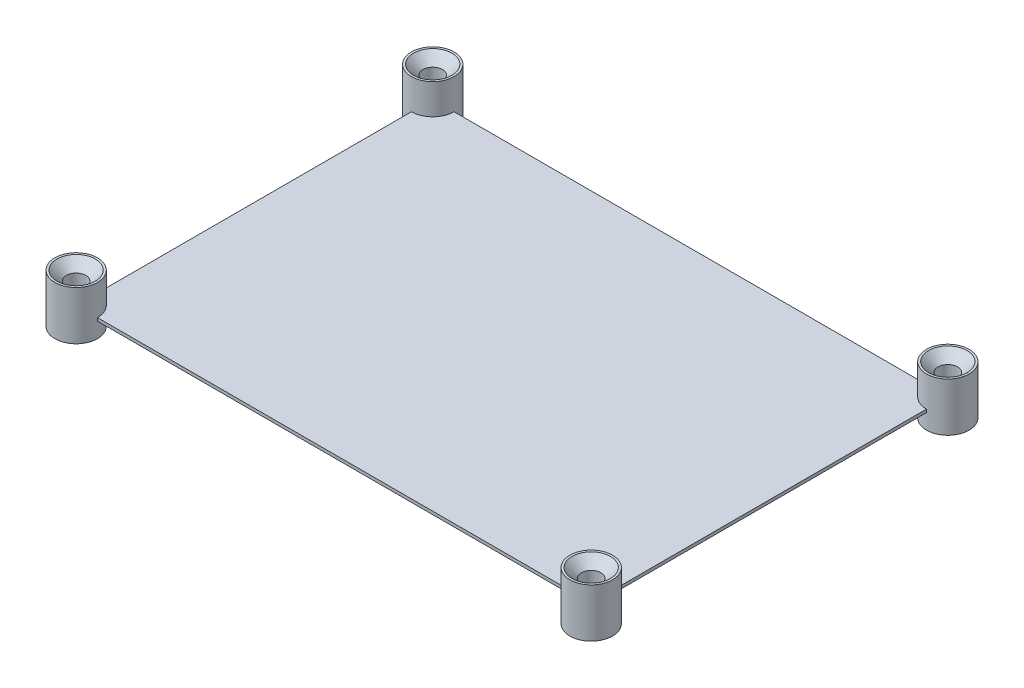
ISO-10303-21;
HEADER;
FILE_DESCRIPTION(('STEP AP214'),'2;1');
FILE_NAME('part.step','',(''),(''),'','','');
FILE_SCHEMA(('AUTOMOTIVE_DESIGN { 1 0 10303 214 1 1 1 1 }'));
ENDSEC;
DATA;
#1=APPLICATION_CONTEXT('core data for automotive mechanical design processes');
#2=APPLICATION_PROTOCOL_DEFINITION('international standard','automotive_design',2000,#1);
#3=PRODUCT_CONTEXT('',#1,'mechanical');
#4=PRODUCT('Part','Part','',(#3));
#5=PRODUCT_RELATED_PRODUCT_CATEGORY('part','',(#4));
#6=PRODUCT_DEFINITION_FORMATION('','',#4);
#7=PRODUCT_DEFINITION_CONTEXT('part definition',#1,'design');
#8=PRODUCT_DEFINITION('design','',#6,#7);
#9=PRODUCT_DEFINITION_SHAPE('','',#8);
#10=(LENGTH_UNIT() NAMED_UNIT(*) SI_UNIT(.MILLI.,.METRE.));
#11=(NAMED_UNIT(*) PLANE_ANGLE_UNIT() SI_UNIT($,.RADIAN.));
#12=(NAMED_UNIT(*) SI_UNIT($,.STERADIAN.) SOLID_ANGLE_UNIT());
#13=UNCERTAINTY_MEASURE_WITH_UNIT(LENGTH_MEASURE(1.E-05),#10,'distance_accuracy_value','');
#14=(GEOMETRIC_REPRESENTATION_CONTEXT(3) GLOBAL_UNCERTAINTY_ASSIGNED_CONTEXT((#13)) GLOBAL_UNIT_ASSIGNED_CONTEXT((#10,
#11,#12)) REPRESENTATION_CONTEXT('',''));
#15=CARTESIAN_POINT('',(0.,0.,0.));
#16=DIRECTION('',(0.,0.,1.));
#17=DIRECTION('',(1.,0.,0.));
#18=AXIS2_PLACEMENT_3D('',#15,#16,#17);
#19=CARTESIAN_POINT('',(0.,0.5,0.));
#20=DIRECTION('',(-1.,0.,0.));
#21=DIRECTION('',(0.,0.,1.));
#22=AXIS2_PLACEMENT_3D('',#19,#20,#21);
#23=PLANE('',#22);
#24=DIRECTION('',(0.,0.,-1.));
#25=VECTOR('',#24,1.);
#26=CARTESIAN_POINT('',(0.,0.,0.));
#27=LINE('',#26,#25);
#28=CARTESIAN_POINT('',(0.,0.,55.));
#29=VERTEX_POINT('',#28);
#30=CARTESIAN_POINT('',(0.,0.,3.50000000000001));
#31=VERTEX_POINT('',#30);
#32=EDGE_CURVE('E123',#29,#31,#27,.T.);
#33=ORIENTED_EDGE('',*,*,#32,.T.);
#34=DIRECTION('',(0.,1.,0.));
#35=VECTOR('',#34,1.);
#36=CARTESIAN_POINT('',(0.,-2.5,3.50000000000001));
#37=LINE('',#36,#35);
#38=CARTESIAN_POINT('',(0.,0.5,3.50000000000001));
#39=VERTEX_POINT('',#38);
#40=EDGE_CURVE('E70',#31,#39,#37,.T.);
#41=ORIENTED_EDGE('',*,*,#40,.T.);
#42=DIRECTION('',(0.,0.,-1.));
#43=VECTOR('',#42,1.);
#44=CARTESIAN_POINT('',(0.,0.5,0.));
#45=LINE('',#44,#43);
#46=CARTESIAN_POINT('',(0.,0.5,55.));
#47=VERTEX_POINT('',#46);
#48=EDGE_CURVE('E194',#47,#39,#45,.T.);
#49=ORIENTED_EDGE('',*,*,#48,.F.);
#50=DIRECTION('',(0.,1.,0.));
#51=VECTOR('',#50,1.);
#52=CARTESIAN_POINT('',(0.,-2.5,55.));
#53=LINE('',#52,#51);
#54=EDGE_CURVE('E151',#47,#29,#53,.F.);
#55=ORIENTED_EDGE('',*,*,#54,.T.);
#56=EDGE_LOOP('',(#33,#41,#49,#55));
#57=FACE_BOUND('',#56,.T.);
#58=ADVANCED_FACE('F45',(#57),#23,.F.);
#59=CARTESIAN_POINT('',(0.,0.5,0.));
#60=DIRECTION('',(0.,0.,1.));
#61=DIRECTION('',(1.,0.,0.));
#62=AXIS2_PLACEMENT_3D('',#59,#60,#61);
#63=PLANE('',#62);
#64=DIRECTION('',(-1.,0.,0.));
#65=VECTOR('',#64,1.);
#66=CARTESIAN_POINT('',(0.,0.5,0.));
#67=LINE('',#66,#65);
#68=CARTESIAN_POINT('',(-3.50000000000001,0.5,0.));
#69=VERTEX_POINT('',#68);
#70=CARTESIAN_POINT('',(-81.,0.5,0.));
#71=VERTEX_POINT('',#70);
#72=EDGE_CURVE('E128',#69,#71,#67,.T.);
#73=ORIENTED_EDGE('',*,*,#72,.F.);
#74=DIRECTION('',(0.,1.,0.));
#75=VECTOR('',#74,1.);
#76=CARTESIAN_POINT('',(-3.50000000000001,-2.5,0.));
#77=LINE('',#76,#75);
#78=CARTESIAN_POINT('',(-3.50000000000001,0.,0.));
#79=VERTEX_POINT('',#78);
#80=EDGE_CURVE('E126',#69,#79,#77,.F.);
#81=ORIENTED_EDGE('',*,*,#80,.T.);
#82=DIRECTION('',(-1.,0.,0.));
#83=VECTOR('',#82,1.);
#84=CARTESIAN_POINT('',(0.,0.,0.));
#85=LINE('',#84,#83);
#86=CARTESIAN_POINT('',(-81.,0.,0.));
#87=VERTEX_POINT('',#86);
#88=EDGE_CURVE('E113',#79,#87,#85,.T.);
#89=ORIENTED_EDGE('',*,*,#88,.T.);
#90=DIRECTION('',(0.,1.,0.));
#91=VECTOR('',#90,1.);
#92=CARTESIAN_POINT('',(-81.,-2.5,0.));
#93=LINE('',#92,#91);
#94=EDGE_CURVE('E188',#87,#71,#93,.T.);
#95=ORIENTED_EDGE('',*,*,#94,.T.);
#96=EDGE_LOOP('',(#73,#81,#89,#95));
#97=FACE_BOUND('',#96,.T.);
#98=ADVANCED_FACE('F127',(#97),#63,.F.);
#99=CARTESIAN_POINT('',(-84.5,0.5,0.));
#100=DIRECTION('',(1.,0.,0.));
#101=DIRECTION('',(0.,0.,-1.));
#102=AXIS2_PLACEMENT_3D('',#99,#100,#101);
#103=PLANE('',#102);
#104=DIRECTION('',(0.,0.,1.));
#105=VECTOR('',#104,1.);
#106=CARTESIAN_POINT('',(-84.5,0.,0.));
#107=LINE('',#106,#105);
#108=CARTESIAN_POINT('',(-84.5,0.,3.50000000000002));
#109=VERTEX_POINT('',#108);
#110=CARTESIAN_POINT('',(-84.5,0.,55.));
#111=VERTEX_POINT('',#110);
#112=EDGE_CURVE('E122',#109,#111,#107,.T.);
#113=ORIENTED_EDGE('',*,*,#112,.T.);
#114=DIRECTION('',(0.,1.,0.));
#115=VECTOR('',#114,1.);
#116=CARTESIAN_POINT('',(-84.5,-2.5,55.));
#117=LINE('',#116,#115);
#118=CARTESIAN_POINT('',(-84.5,0.5,55.));
#119=VERTEX_POINT('',#118);
#120=EDGE_CURVE('E170',#111,#119,#117,.T.);
#121=ORIENTED_EDGE('',*,*,#120,.T.);
#122=DIRECTION('',(0.,0.,1.));
#123=VECTOR('',#122,1.);
#124=CARTESIAN_POINT('',(-84.5,0.5,0.));
#125=LINE('',#124,#123);
#126=CARTESIAN_POINT('',(-84.5,0.5,3.50000000000002));
#127=VERTEX_POINT('',#126);
#128=EDGE_CURVE('E200',#127,#119,#125,.T.);
#129=ORIENTED_EDGE('',*,*,#128,.F.);
#130=DIRECTION('',(0.,1.,0.));
#131=VECTOR('',#130,1.);
#132=CARTESIAN_POINT('',(-84.5,-2.5,3.50000000000002));
#133=LINE('',#132,#131);
#134=EDGE_CURVE('E184',#127,#109,#133,.F.);
#135=ORIENTED_EDGE('',*,*,#134,.T.);
#136=EDGE_LOOP('',(#113,#121,#129,#135));
#137=FACE_BOUND('',#136,.T.);
#138=ADVANCED_FACE('F293',(#137),#103,.F.);
#139=CARTESIAN_POINT('',(0.,0.5,58.5));
#140=DIRECTION('',(0.,0.,-1.));
#141=DIRECTION('',(-1.,0.,0.));
#142=AXIS2_PLACEMENT_3D('',#139,#140,#141);
#143=PLANE('',#142);
#144=DIRECTION('',(1.,0.,0.));
#145=VECTOR('',#144,1.);
#146=CARTESIAN_POINT('',(0.,0.,58.5));
#147=LINE('',#146,#145);
#148=CARTESIAN_POINT('',(-81.,0.,58.5));
#149=VERTEX_POINT('',#148);
#150=CARTESIAN_POINT('',(-3.5,0.,58.5));
#151=VERTEX_POINT('',#150);
#152=EDGE_CURVE('E197',#149,#151,#147,.T.);
#153=ORIENTED_EDGE('',*,*,#152,.T.);
#154=DIRECTION('',(0.,1.,0.));
#155=VECTOR('',#154,1.);
#156=CARTESIAN_POINT('',(-3.5,-2.5,58.5));
#157=LINE('',#156,#155);
#158=CARTESIAN_POINT('',(-3.5,0.5,58.5));
#159=VERTEX_POINT('',#158);
#160=EDGE_CURVE('E148',#151,#159,#157,.T.);
#161=ORIENTED_EDGE('',*,*,#160,.T.);
#162=DIRECTION('',(1.,0.,0.));
#163=VECTOR('',#162,1.);
#164=CARTESIAN_POINT('',(0.,0.5,58.5));
#165=LINE('',#164,#163);
#166=CARTESIAN_POINT('',(-81.,0.5,58.5));
#167=VERTEX_POINT('',#166);
#168=EDGE_CURVE('E204',#167,#159,#165,.T.);
#169=ORIENTED_EDGE('',*,*,#168,.F.);
#170=DIRECTION('',(0.,1.,0.));
#171=VECTOR('',#170,1.);
#172=CARTESIAN_POINT('',(-81.,-2.5,58.5));
#173=LINE('',#172,#171);
#174=EDGE_CURVE('E166',#167,#149,#173,.F.);
#175=ORIENTED_EDGE('',*,*,#174,.T.);
#176=EDGE_LOOP('',(#153,#161,#169,#175));
#177=FACE_BOUND('',#176,.T.);
#178=ADVANCED_FACE('F298',(#177),#143,.F.);
#179=CARTESIAN_POINT('',(0.,0.5,0.));
#180=DIRECTION('',(0.,-1.,0.));
#181=DIRECTION('',(0.,0.,-1.));
#182=AXIS2_PLACEMENT_3D('',#179,#180,#181);
#183=PLANE('',#182);
#184=ORIENTED_EDGE('',*,*,#48,.T.);
#185=CARTESIAN_POINT('',(0.,0.5,0.));
#186=DIRECTION('',(0.,-1.,0.));
#187=DIRECTION('',(0.,0.,-1.));
#188=AXIS2_PLACEMENT_3D('',#185,#186,#187);
#189=CIRCLE('',#188,3.50000000000001);
#190=EDGE_CURVE('E62',#39,#69,#189,.T.);
#191=ORIENTED_EDGE('',*,*,#190,.T.);
#192=ORIENTED_EDGE('',*,*,#72,.T.);
#193=CARTESIAN_POINT('',(-84.5,0.5,0.));
#194=DIRECTION('',(0.,-1.,0.));
#195=DIRECTION('',(0.,0.,-1.));
#196=AXIS2_PLACEMENT_3D('',#193,#194,#195);
#197=CIRCLE('',#196,3.50000000000001);
#198=EDGE_CURVE('E191',#71,#127,#197,.T.);
#199=ORIENTED_EDGE('',*,*,#198,.T.);
#200=ORIENTED_EDGE('',*,*,#128,.T.);
#201=CARTESIAN_POINT('',(-84.5,0.5,58.5));
#202=DIRECTION('',(0.,-1.,0.));
#203=DIRECTION('',(0.,0.,-1.));
#204=AXIS2_PLACEMENT_3D('',#201,#202,#203);
#205=CIRCLE('',#204,3.50000000000001);
#206=EDGE_CURVE('E173',#119,#167,#205,.T.);
#207=ORIENTED_EDGE('',*,*,#206,.T.);
#208=ORIENTED_EDGE('',*,*,#168,.T.);
#209=CARTESIAN_POINT('',(0.,0.5,58.5));
#210=DIRECTION('',(0.,-1.,0.));
#211=DIRECTION('',(0.,0.,-1.));
#212=AXIS2_PLACEMENT_3D('',#209,#210,#211);
#213=CIRCLE('',#212,3.50000000000001);
#214=EDGE_CURVE('E155',#159,#47,#213,.T.);
#215=ORIENTED_EDGE('',*,*,#214,.T.);
#216=EDGE_LOOP('',(#184,#191,#192,#199,#200,#207,#208,#215));
#217=FACE_BOUND('',#216,.T.);
#218=ADVANCED_FACE('F303',(#217),#183,.F.);
#219=CARTESIAN_POINT('',(0.,0.,0.));
#220=DIRECTION('',(0.,-1.,0.));
#221=DIRECTION('',(0.,0.,-1.));
#222=AXIS2_PLACEMENT_3D('',#219,#220,#221);
#223=PLANE('',#222);
#224=CARTESIAN_POINT('',(0.,0.,0.));
#225=DIRECTION('',(0.,-1.,0.));
#226=DIRECTION('',(0.,0.,-1.));
#227=AXIS2_PLACEMENT_3D('',#224,#225,#226);
#228=CIRCLE('',#227,3.50000000000001);
#229=EDGE_CURVE('E11',#31,#79,#228,.T.);
#230=ORIENTED_EDGE('',*,*,#229,.F.);
#231=ORIENTED_EDGE('',*,*,#32,.F.);
#232=CARTESIAN_POINT('',(0.,0.,58.5));
#233=DIRECTION('',(0.,-1.,0.));
#234=DIRECTION('',(0.,0.,-1.));
#235=AXIS2_PLACEMENT_3D('',#232,#233,#234);
#236=CIRCLE('',#235,3.50000000000001);
#237=EDGE_CURVE('E54',#151,#29,#236,.T.);
#238=ORIENTED_EDGE('',*,*,#237,.F.);
#239=ORIENTED_EDGE('',*,*,#152,.F.);
#240=CARTESIAN_POINT('',(-84.5,0.,58.5));
#241=DIRECTION('',(0.,-1.,0.));
#242=DIRECTION('',(0.,0.,-1.));
#243=AXIS2_PLACEMENT_3D('',#240,#241,#242);
#244=CIRCLE('',#243,3.50000000000001);
#245=EDGE_CURVE('E218',#111,#149,#244,.T.);
#246=ORIENTED_EDGE('',*,*,#245,.F.);
#247=ORIENTED_EDGE('',*,*,#112,.F.);
#248=CARTESIAN_POINT('',(-84.5,0.,0.));
#249=DIRECTION('',(0.,-1.,0.));
#250=DIRECTION('',(0.,0.,-1.));
#251=AXIS2_PLACEMENT_3D('',#248,#249,#250);
#252=CIRCLE('',#251,3.50000000000001);
#253=EDGE_CURVE('E117',#87,#109,#252,.T.);
#254=ORIENTED_EDGE('',*,*,#253,.F.);
#255=ORIENTED_EDGE('',*,*,#88,.F.);
#256=EDGE_LOOP('',(#230,#231,#238,#239,#246,#247,#254,#255));
#257=FACE_BOUND('',#256,.T.);
#258=ADVANCED_FACE('F115',(#257),#223,.T.);
#259=CARTESIAN_POINT('',(-84.5,-2.5,0.));
#260=DIRECTION('',(0.,1.,0.));
#261=DIRECTION('',(0.,0.,1.));
#262=AXIS2_PLACEMENT_3D('',#259,#260,#261);
#263=CYLINDRICAL_SURFACE('',#262,3.50000000000001);
#264=CARTESIAN_POINT('',(-84.5,5.5,0.));
#265=DIRECTION('',(0.,1.,0.));
#266=DIRECTION('',(0.,0.,1.));
#267=AXIS2_PLACEMENT_3D('',#264,#265,#266);
#268=CIRCLE('',#267,3.50000000000001);
#269=CARTESIAN_POINT('',(-84.5,5.5,3.50000000000002));
#270=VERTEX_POINT('',#269);
#271=EDGE_CURVE('E176',#270,#270,#268,.T.);
#272=ORIENTED_EDGE('',*,*,#271,.F.);
#273=EDGE_LOOP('',(#272));
#274=FACE_BOUND('',#273,.T.);
#275=CARTESIAN_POINT('',(-84.5,-2.5,0.));
#276=DIRECTION('',(0.,1.,0.));
#277=DIRECTION('',(0.,0.,1.));
#278=AXIS2_PLACEMENT_3D('',#275,#276,#277);
#279=CIRCLE('',#278,3.50000000000001);
#280=CARTESIAN_POINT('',(-84.5,-2.5,3.50000000000002));
#281=VERTEX_POINT('',#280);
#282=EDGE_CURVE('E180',#281,#281,#279,.T.);
#283=ORIENTED_EDGE('',*,*,#282,.T.);
#284=EDGE_LOOP('',(#283));
#285=FACE_BOUND('',#284,.T.);
#286=ORIENTED_EDGE('',*,*,#198,.F.);
#287=ORIENTED_EDGE('',*,*,#94,.F.);
#288=ORIENTED_EDGE('',*,*,#253,.T.);
#289=ORIENTED_EDGE('',*,*,#134,.F.);
#290=EDGE_LOOP('',(#286,#287,#288,#289));
#291=FACE_BOUND('',#290,.T.);
#292=ADVANCED_FACE('F313',(#274,#285,#291),#263,.T.);
#293=CARTESIAN_POINT('',(-84.5,-2.5,0.));
#294=DIRECTION('',(0.,1.,0.));
#295=DIRECTION('',(0.,0.,1.));
#296=AXIS2_PLACEMENT_3D('',#293,#294,#295);
#297=PLANE('',#296);
#298=CARTESIAN_POINT('',(-84.5,-2.5,0.));
#299=DIRECTION('',(0.,1.,0.));
#300=DIRECTION('',(0.,0.,1.));
#301=AXIS2_PLACEMENT_3D('',#298,#299,#300);
#302=CIRCLE('',#301,1.6);
#303=CARTESIAN_POINT('',(-84.5,-2.5,1.60000000000001));
#304=VERTEX_POINT('',#303);
#305=EDGE_CURVE('E225',#304,#304,#302,.T.);
#306=ORIENTED_EDGE('',*,*,#305,.T.);
#307=EDGE_LOOP('',(#306));
#308=FACE_BOUND('',#307,.T.);
#309=ORIENTED_EDGE('',*,*,#282,.F.);
#310=EDGE_LOOP('',(#309));
#311=FACE_BOUND('',#310,.T.);
#312=ADVANCED_FACE('F315',(#308,#311),#297,.F.);
#313=CARTESIAN_POINT('',(-84.5,5.5,0.));
#314=DIRECTION('',(0.,1.,0.));
#315=DIRECTION('',(0.,0.,1.));
#316=AXIS2_PLACEMENT_3D('',#313,#314,#315);
#317=PLANE('',#316);
#318=CARTESIAN_POINT('',(-84.5,5.5,0.));
#319=DIRECTION('',(0.,1.,0.));
#320=DIRECTION('',(0.,0.,1.));
#321=AXIS2_PLACEMENT_3D('',#318,#319,#320);
#322=CIRCLE('',#321,3.15);
#323=CARTESIAN_POINT('',(-84.5,5.5,3.15000000000001));
#324=VERTEX_POINT('',#323);
#325=EDGE_CURVE('E234',#324,#324,#322,.T.);
#326=ORIENTED_EDGE('',*,*,#325,.F.);
#327=EDGE_LOOP('',(#326));
#328=FACE_BOUND('',#327,.T.);
#329=ORIENTED_EDGE('',*,*,#271,.T.);
#330=EDGE_LOOP('',(#329));
#331=FACE_BOUND('',#330,.T.);
#332=ADVANCED_FACE('F322',(#328,#331),#317,.T.);
#333=CARTESIAN_POINT('',(-84.5,-2.5,58.5));
#334=DIRECTION('',(0.,1.,0.));
#335=DIRECTION('',(0.,0.,1.));
#336=AXIS2_PLACEMENT_3D('',#333,#334,#335);
#337=CYLINDRICAL_SURFACE('',#336,3.50000000000001);
#338=CARTESIAN_POINT('',(-84.5,5.5,58.5));
#339=DIRECTION('',(0.,1.,0.));
#340=DIRECTION('',(0.,0.,1.));
#341=AXIS2_PLACEMENT_3D('',#338,#339,#340);
#342=CIRCLE('',#341,3.50000000000001);
#343=CARTESIAN_POINT('',(-84.5,5.5,62.));
#344=VERTEX_POINT('',#343);
#345=EDGE_CURVE('E158',#344,#344,#342,.T.);
#346=ORIENTED_EDGE('',*,*,#345,.F.);
#347=EDGE_LOOP('',(#346));
#348=FACE_BOUND('',#347,.T.);
#349=CARTESIAN_POINT('',(-84.5,-2.5,58.5));
#350=DIRECTION('',(0.,1.,0.));
#351=DIRECTION('',(0.,0.,1.));
#352=AXIS2_PLACEMENT_3D('',#349,#350,#351);
#353=CIRCLE('',#352,3.50000000000001);
#354=CARTESIAN_POINT('',(-84.5,-2.5,62.));
#355=VERTEX_POINT('',#354);
#356=EDGE_CURVE('E162',#355,#355,#353,.T.);
#357=ORIENTED_EDGE('',*,*,#356,.T.);
#358=EDGE_LOOP('',(#357));
#359=FACE_BOUND('',#358,.T.);
#360=ORIENTED_EDGE('',*,*,#206,.F.);
#361=ORIENTED_EDGE('',*,*,#120,.F.);
#362=ORIENTED_EDGE('',*,*,#245,.T.);
#363=ORIENTED_EDGE('',*,*,#174,.F.);
#364=EDGE_LOOP('',(#360,#361,#362,#363));
#365=FACE_BOUND('',#364,.T.);
#366=ADVANCED_FACE('F306',(#348,#359,#365),#337,.T.);
#367=CARTESIAN_POINT('',(-84.5,-2.5,58.5));
#368=DIRECTION('',(0.,1.,0.));
#369=DIRECTION('',(0.,0.,1.));
#370=AXIS2_PLACEMENT_3D('',#367,#368,#369);
#371=PLANE('',#370);
#372=CARTESIAN_POINT('',(-84.5,-2.5,58.5));
#373=DIRECTION('',(0.,1.,0.));
#374=DIRECTION('',(0.,0.,1.));
#375=AXIS2_PLACEMENT_3D('',#372,#373,#374);
#376=CIRCLE('',#375,1.59999999999999);
#377=CARTESIAN_POINT('',(-84.5,-2.5,60.1));
#378=VERTEX_POINT('',#377);
#379=EDGE_CURVE('E231',#378,#378,#376,.T.);
#380=ORIENTED_EDGE('',*,*,#379,.T.);
#381=EDGE_LOOP('',(#380));
#382=FACE_BOUND('',#381,.T.);
#383=ORIENTED_EDGE('',*,*,#356,.F.);
#384=EDGE_LOOP('',(#383));
#385=FACE_BOUND('',#384,.T.);
#386=ADVANCED_FACE('F345',(#382,#385),#371,.F.);
#387=CARTESIAN_POINT('',(-84.5,5.5,58.5));
#388=DIRECTION('',(0.,1.,0.));
#389=DIRECTION('',(0.,0.,1.));
#390=AXIS2_PLACEMENT_3D('',#387,#388,#389);
#391=PLANE('',#390);
#392=CARTESIAN_POINT('',(-84.5,5.5,58.5));
#393=DIRECTION('',(0.,1.,0.));
#394=DIRECTION('',(0.,0.,1.));
#395=AXIS2_PLACEMENT_3D('',#392,#393,#394);
#396=CIRCLE('',#395,3.15);
#397=CARTESIAN_POINT('',(-84.5,5.5,61.65));
#398=VERTEX_POINT('',#397);
#399=EDGE_CURVE('E239',#398,#398,#396,.T.);
#400=ORIENTED_EDGE('',*,*,#399,.F.);
#401=EDGE_LOOP('',(#400));
#402=FACE_BOUND('',#401,.T.);
#403=ORIENTED_EDGE('',*,*,#345,.T.);
#404=EDGE_LOOP('',(#403));
#405=FACE_BOUND('',#404,.T.);
#406=ADVANCED_FACE('F361',(#402,#405),#391,.T.);
#407=CARTESIAN_POINT('',(0.,-2.5,58.5));
#408=DIRECTION('',(0.,1.,0.));
#409=DIRECTION('',(0.,0.,1.));
#410=AXIS2_PLACEMENT_3D('',#407,#408,#409);
#411=CYLINDRICAL_SURFACE('',#410,3.50000000000001);
#412=CARTESIAN_POINT('',(0.,5.5,58.5));
#413=DIRECTION('',(0.,1.,0.));
#414=DIRECTION('',(0.,0.,1.));
#415=AXIS2_PLACEMENT_3D('',#412,#413,#414);
#416=CIRCLE('',#415,3.50000000000001);
#417=CARTESIAN_POINT('',(0.,5.5,62.));
#418=VERTEX_POINT('',#417);
#419=EDGE_CURVE('E137',#418,#418,#416,.T.);
#420=ORIENTED_EDGE('',*,*,#419,.F.);
#421=EDGE_LOOP('',(#420));
#422=FACE_BOUND('',#421,.T.);
#423=CARTESIAN_POINT('',(0.,-2.5,58.5));
#424=DIRECTION('',(0.,1.,0.));
#425=DIRECTION('',(0.,0.,1.));
#426=AXIS2_PLACEMENT_3D('',#423,#424,#425);
#427=CIRCLE('',#426,3.50000000000001);
#428=CARTESIAN_POINT('',(0.,-2.5,62.));
#429=VERTEX_POINT('',#428);
#430=EDGE_CURVE('E144',#429,#429,#427,.T.);
#431=ORIENTED_EDGE('',*,*,#430,.T.);
#432=EDGE_LOOP('',(#431));
#433=FACE_BOUND('',#432,.T.);
#434=ORIENTED_EDGE('',*,*,#214,.F.);
#435=ORIENTED_EDGE('',*,*,#160,.F.);
#436=ORIENTED_EDGE('',*,*,#237,.T.);
#437=ORIENTED_EDGE('',*,*,#54,.F.);
#438=EDGE_LOOP('',(#434,#435,#436,#437));
#439=FACE_BOUND('',#438,.T.);
#440=ADVANCED_FACE('F302',(#422,#433,#439),#411,.T.);
#441=CARTESIAN_POINT('',(0.,-2.5,58.5));
#442=DIRECTION('',(0.,1.,0.));
#443=DIRECTION('',(0.,0.,1.));
#444=AXIS2_PLACEMENT_3D('',#441,#442,#443);
#445=PLANE('',#444);
#446=CARTESIAN_POINT('',(0.,-2.5,58.5));
#447=DIRECTION('',(0.,1.,0.));
#448=DIRECTION('',(0.,0.,1.));
#449=AXIS2_PLACEMENT_3D('',#446,#447,#448);
#450=CIRCLE('',#449,1.59999999999999);
#451=CARTESIAN_POINT('',(0.,-2.5,60.1));
#452=VERTEX_POINT('',#451);
#453=EDGE_CURVE('E48',#452,#452,#450,.T.);
#454=ORIENTED_EDGE('',*,*,#453,.T.);
#455=EDGE_LOOP('',(#454));
#456=FACE_BOUND('',#455,.T.);
#457=ORIENTED_EDGE('',*,*,#430,.F.);
#458=EDGE_LOOP('',(#457));
#459=FACE_BOUND('',#458,.T.);
#460=ADVANCED_FACE('F360',(#456,#459),#445,.F.);
#461=CARTESIAN_POINT('',(0.,5.5,58.5));
#462=DIRECTION('',(0.,1.,0.));
#463=DIRECTION('',(0.,0.,1.));
#464=AXIS2_PLACEMENT_3D('',#461,#462,#463);
#465=PLANE('',#464);
#466=CARTESIAN_POINT('',(0.,5.5,58.5));
#467=DIRECTION('',(0.,1.,0.));
#468=DIRECTION('',(0.,0.,1.));
#469=AXIS2_PLACEMENT_3D('',#466,#467,#468);
#470=CIRCLE('',#469,3.15);
#471=CARTESIAN_POINT('',(0.,5.5,61.65));
#472=VERTEX_POINT('',#471);
#473=EDGE_CURVE('E492',#472,#472,#470,.T.);
#474=ORIENTED_EDGE('',*,*,#473,.F.);
#475=EDGE_LOOP('',(#474));
#476=FACE_BOUND('',#475,.T.);
#477=ORIENTED_EDGE('',*,*,#419,.T.);
#478=EDGE_LOOP('',(#477));
#479=FACE_BOUND('',#478,.T.);
#480=ADVANCED_FACE('F285',(#476,#479),#465,.T.);
#481=CARTESIAN_POINT('',(0.,-2.5,0.));
#482=DIRECTION('',(0.,1.,0.));
#483=DIRECTION('',(0.,0.,1.));
#484=AXIS2_PLACEMENT_3D('',#481,#482,#483);
#485=CYLINDRICAL_SURFACE('',#484,3.50000000000001);
#486=CARTESIAN_POINT('',(0.,5.5,0.));
#487=DIRECTION('',(0.,1.,0.));
#488=DIRECTION('',(0.,0.,1.));
#489=AXIS2_PLACEMENT_3D('',#486,#487,#488);
#490=CIRCLE('',#489,3.50000000000001);
#491=CARTESIAN_POINT('',(0.,5.5,3.50000000000001));
#492=VERTEX_POINT('',#491);
#493=EDGE_CURVE('E229',#492,#492,#490,.T.);
#494=ORIENTED_EDGE('',*,*,#493,.F.);
#495=EDGE_LOOP('',(#494));
#496=FACE_BOUND('',#495,.T.);
#497=CARTESIAN_POINT('',(0.,-2.5,0.));
#498=DIRECTION('',(0.,1.,0.));
#499=DIRECTION('',(0.,0.,1.));
#500=AXIS2_PLACEMENT_3D('',#497,#498,#499);
#501=CIRCLE('',#500,3.50000000000001);
#502=CARTESIAN_POINT('',(0.,-2.5,3.50000000000001));
#503=VERTEX_POINT('',#502);
#504=EDGE_CURVE('E131',#503,#503,#501,.T.);
#505=ORIENTED_EDGE('',*,*,#504,.T.);
#506=EDGE_LOOP('',(#505));
#507=FACE_BOUND('',#506,.T.);
#508=ORIENTED_EDGE('',*,*,#190,.F.);
#509=ORIENTED_EDGE('',*,*,#40,.F.);
#510=ORIENTED_EDGE('',*,*,#229,.T.);
#511=ORIENTED_EDGE('',*,*,#80,.F.);
#512=EDGE_LOOP('',(#508,#509,#510,#511));
#513=FACE_BOUND('',#512,.T.);
#514=ADVANCED_FACE('F133',(#496,#507,#513),#485,.T.);
#515=CARTESIAN_POINT('',(0.,-2.5,0.));
#516=DIRECTION('',(0.,1.,0.));
#517=DIRECTION('',(0.,0.,1.));
#518=AXIS2_PLACEMENT_3D('',#515,#516,#517);
#519=PLANE('',#518);
#520=CARTESIAN_POINT('',(0.,-2.5,0.));
#521=DIRECTION('',(0.,1.,0.));
#522=DIRECTION('',(0.,0.,1.));
#523=AXIS2_PLACEMENT_3D('',#520,#521,#522);
#524=CIRCLE('',#523,1.6);
#525=CARTESIAN_POINT('',(0.,-2.5,1.6));
#526=VERTEX_POINT('',#525);
#527=EDGE_CURVE('E236',#526,#526,#524,.T.);
#528=ORIENTED_EDGE('',*,*,#527,.T.);
#529=EDGE_LOOP('',(#528));
#530=FACE_BOUND('',#529,.T.);
#531=ORIENTED_EDGE('',*,*,#504,.F.);
#532=EDGE_LOOP('',(#531));
#533=FACE_BOUND('',#532,.T.);
#534=ADVANCED_FACE('F273',(#530,#533),#519,.F.);
#535=CARTESIAN_POINT('',(0.,5.5,0.));
#536=DIRECTION('',(0.,1.,0.));
#537=DIRECTION('',(0.,0.,1.));
#538=AXIS2_PLACEMENT_3D('',#535,#536,#537);
#539=PLANE('',#538);
#540=CARTESIAN_POINT('',(0.,5.5,0.));
#541=DIRECTION('',(0.,1.,0.));
#542=DIRECTION('',(0.,0.,1.));
#543=AXIS2_PLACEMENT_3D('',#540,#541,#542);
#544=CIRCLE('',#543,3.15);
#545=CARTESIAN_POINT('',(0.,5.5,3.15));
#546=VERTEX_POINT('',#545);
#547=EDGE_CURVE('E248',#546,#546,#544,.T.);
#548=ORIENTED_EDGE('',*,*,#547,.F.);
#549=EDGE_LOOP('',(#548));
#550=FACE_BOUND('',#549,.T.);
#551=ORIENTED_EDGE('',*,*,#493,.T.);
#552=EDGE_LOOP('',(#551));
#553=FACE_BOUND('',#552,.T.);
#554=ADVANCED_FACE('F275',(#550,#553),#539,.T.);
#555=CARTESIAN_POINT('',(-84.5,5.5,0.));
#556=DIRECTION('',(0.,1.,0.));
#557=DIRECTION('',(0.,0.,1.));
#558=AXIS2_PLACEMENT_3D('',#555,#556,#557);
#559=CYLINDRICAL_SURFACE('',#558,1.6);
#560=CARTESIAN_POINT('',(-84.5,3.95,0.));
#561=DIRECTION('',(0.,1.,0.));
#562=DIRECTION('',(0.,0.,1.));
#563=AXIS2_PLACEMENT_3D('',#560,#561,#562);
#564=CIRCLE('',#563,1.6);
#565=CARTESIAN_POINT('',(-84.5,3.95,1.60000000000001));
#566=VERTEX_POINT('',#565);
#567=EDGE_CURVE('E230',#566,#566,#564,.T.);
#568=ORIENTED_EDGE('',*,*,#567,.T.);
#569=EDGE_LOOP('',(#568));
#570=FACE_BOUND('',#569,.T.);
#571=ORIENTED_EDGE('',*,*,#305,.F.);
#572=EDGE_LOOP('',(#571));
#573=FACE_BOUND('',#572,.T.);
#574=ADVANCED_FACE('F281',(#570,#573),#559,.F.);
#575=CARTESIAN_POINT('',(-84.5,5.5,0.));
#576=DIRECTION('',(0.,1.,0.));
#577=DIRECTION('',(0.,0.,1.));
#578=AXIS2_PLACEMENT_3D('',#575,#576,#577);
#579=CONICAL_SURFACE('',#578,3.15,0.785398163397447);
#580=ORIENTED_EDGE('',*,*,#567,.F.);
#581=EDGE_LOOP('',(#580));
#582=FACE_BOUND('',#581,.T.);
#583=ORIENTED_EDGE('',*,*,#325,.T.);
#584=EDGE_LOOP('',(#583));
#585=FACE_BOUND('',#584,.T.);
#586=ADVANCED_FACE('F416',(#582,#585),#579,.F.);
#587=CARTESIAN_POINT('',(-84.5,5.5,58.5));
#588=DIRECTION('',(0.,1.,0.));
#589=DIRECTION('',(0.,0.,1.));
#590=AXIS2_PLACEMENT_3D('',#587,#588,#589);
#591=CYLINDRICAL_SURFACE('',#590,1.59999999999999);
#592=CARTESIAN_POINT('',(-84.5,3.95,58.5));
#593=DIRECTION('',(0.,1.,0.));
#594=DIRECTION('',(0.,0.,1.));
#595=AXIS2_PLACEMENT_3D('',#592,#593,#594);
#596=CIRCLE('',#595,1.59999999999999);
#597=CARTESIAN_POINT('',(-84.5,3.95,60.1));
#598=VERTEX_POINT('',#597);
#599=EDGE_CURVE('E235',#598,#598,#596,.T.);
#600=ORIENTED_EDGE('',*,*,#599,.T.);
#601=EDGE_LOOP('',(#600));
#602=FACE_BOUND('',#601,.T.);
#603=ORIENTED_EDGE('',*,*,#379,.F.);
#604=EDGE_LOOP('',(#603));
#605=FACE_BOUND('',#604,.T.);
#606=ADVANCED_FACE('F427',(#602,#605),#591,.F.);
#607=CARTESIAN_POINT('',(-84.5,5.5,58.5));
#608=DIRECTION('',(0.,1.,0.));
#609=DIRECTION('',(0.,0.,1.));
#610=AXIS2_PLACEMENT_3D('',#607,#608,#609);
#611=CONICAL_SURFACE('',#610,3.15,0.785398163397452);
#612=ORIENTED_EDGE('',*,*,#599,.F.);
#613=EDGE_LOOP('',(#612));
#614=FACE_BOUND('',#613,.T.);
#615=ORIENTED_EDGE('',*,*,#399,.T.);
#616=EDGE_LOOP('',(#615));
#617=FACE_BOUND('',#616,.T.);
#618=ADVANCED_FACE('F438',(#614,#617),#611,.F.);
#619=CARTESIAN_POINT('',(0.,5.5,0.));
#620=DIRECTION('',(0.,1.,0.));
#621=DIRECTION('',(0.,0.,1.));
#622=AXIS2_PLACEMENT_3D('',#619,#620,#621);
#623=CYLINDRICAL_SURFACE('',#622,1.6);
#624=CARTESIAN_POINT('',(0.,3.95,0.));
#625=DIRECTION('',(0.,1.,0.));
#626=DIRECTION('',(0.,0.,1.));
#627=AXIS2_PLACEMENT_3D('',#624,#625,#626);
#628=CIRCLE('',#627,1.6);
#629=CARTESIAN_POINT('',(0.,3.95,1.6));
#630=VERTEX_POINT('',#629);
#631=EDGE_CURVE('E240',#630,#630,#628,.T.);
#632=ORIENTED_EDGE('',*,*,#631,.T.);
#633=EDGE_LOOP('',(#632));
#634=FACE_BOUND('',#633,.T.);
#635=ORIENTED_EDGE('',*,*,#527,.F.);
#636=EDGE_LOOP('',(#635));
#637=FACE_BOUND('',#636,.T.);
#638=ADVANCED_FACE('F447',(#634,#637),#623,.F.);
#639=CARTESIAN_POINT('',(0.,5.5,0.));
#640=DIRECTION('',(0.,1.,0.));
#641=DIRECTION('',(0.,0.,1.));
#642=AXIS2_PLACEMENT_3D('',#639,#640,#641);
#643=CONICAL_SURFACE('',#642,3.15,0.785398163397449);
#644=ORIENTED_EDGE('',*,*,#631,.F.);
#645=EDGE_LOOP('',(#644));
#646=FACE_BOUND('',#645,.T.);
#647=ORIENTED_EDGE('',*,*,#547,.T.);
#648=EDGE_LOOP('',(#647));
#649=FACE_BOUND('',#648,.T.);
#650=ADVANCED_FACE('F456',(#646,#649),#643,.F.);
#651=CARTESIAN_POINT('',(0.,5.5,58.5));
#652=DIRECTION('',(0.,1.,0.));
#653=DIRECTION('',(0.,0.,1.));
#654=AXIS2_PLACEMENT_3D('',#651,#652,#653);
#655=CYLINDRICAL_SURFACE('',#654,1.59999999999999);
#656=CARTESIAN_POINT('',(0.,3.95,58.5));
#657=DIRECTION('',(0.,1.,0.));
#658=DIRECTION('',(0.,0.,1.));
#659=AXIS2_PLACEMENT_3D('',#656,#657,#658);
#660=CIRCLE('',#659,1.59999999999999);
#661=CARTESIAN_POINT('',(0.,3.95,60.1));
#662=VERTEX_POINT('',#661);
#663=EDGE_CURVE('E489',#662,#662,#660,.T.);
#664=ORIENTED_EDGE('',*,*,#663,.T.);
#665=EDGE_LOOP('',(#664));
#666=FACE_BOUND('',#665,.T.);
#667=ORIENTED_EDGE('',*,*,#453,.F.);
#668=EDGE_LOOP('',(#667));
#669=FACE_BOUND('',#668,.T.);
#670=ADVANCED_FACE('F464',(#666,#669),#655,.F.);
#671=CARTESIAN_POINT('',(0.,5.5,58.5));
#672=DIRECTION('',(0.,1.,0.));
#673=DIRECTION('',(0.,0.,1.));
#674=AXIS2_PLACEMENT_3D('',#671,#672,#673);
#675=CONICAL_SURFACE('',#674,3.15,0.785398163397453);
#676=ORIENTED_EDGE('',*,*,#663,.F.);
#677=EDGE_LOOP('',(#676));
#678=FACE_BOUND('',#677,.T.);
#679=ORIENTED_EDGE('',*,*,#473,.T.);
#680=EDGE_LOOP('',(#679));
#681=FACE_BOUND('',#680,.T.);
#682=ADVANCED_FACE('F473',(#678,#681),#675,.F.);
#683=CLOSED_SHELL('',(#58,#98,#138,#178,#218,#258,#292,#312,#332,#366,#386,#406,#440,#460,#480,
#514,#534,#554,#574,#586,#606,#618,#638,#650,#670,#682));
#684=MANIFOLD_SOLID_BREP('B2',#683);
#685=ADVANCED_BREP_SHAPE_REPRESENTATION('',(#18,#684),#14);
#686=SHAPE_DEFINITION_REPRESENTATION(#9,#685);
ENDSEC;
END-ISO-10303-21;
